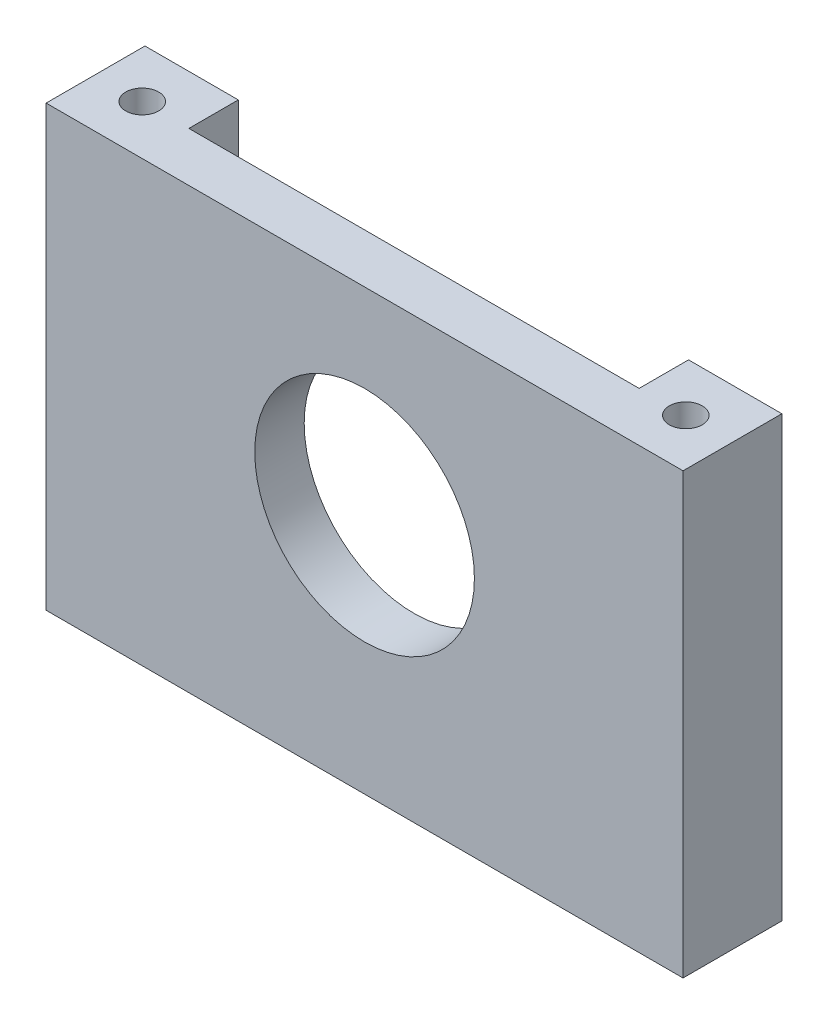
ISO-10303-21;
HEADER;
FILE_DESCRIPTION(('STEP AP214'),'2;1');
FILE_NAME('part.step','',(''),(''),'','','');
FILE_SCHEMA(('AUTOMOTIVE_DESIGN { 1 0 10303 214 1 1 1 1 }'));
ENDSEC;
DATA;
#1=APPLICATION_CONTEXT('core data for automotive mechanical design processes');
#2=APPLICATION_PROTOCOL_DEFINITION('international standard','automotive_design',2000,#1);
#3=PRODUCT_CONTEXT('',#1,'mechanical');
#4=PRODUCT('Part','Part','',(#3));
#5=PRODUCT_RELATED_PRODUCT_CATEGORY('part','',(#4));
#6=PRODUCT_DEFINITION_FORMATION('','',#4);
#7=PRODUCT_DEFINITION_CONTEXT('part definition',#1,'design');
#8=PRODUCT_DEFINITION('design','',#6,#7);
#9=PRODUCT_DEFINITION_SHAPE('','',#8);
#10=(LENGTH_UNIT() NAMED_UNIT(*) SI_UNIT(.MILLI.,.METRE.));
#11=(NAMED_UNIT(*) PLANE_ANGLE_UNIT() SI_UNIT($,.RADIAN.));
#12=(NAMED_UNIT(*) SI_UNIT($,.STERADIAN.) SOLID_ANGLE_UNIT());
#13=UNCERTAINTY_MEASURE_WITH_UNIT(LENGTH_MEASURE(1.E-05),#10,'distance_accuracy_value','');
#14=(GEOMETRIC_REPRESENTATION_CONTEXT(3) GLOBAL_UNCERTAINTY_ASSIGNED_CONTEXT((#13)) GLOBAL_UNIT_ASSIGNED_CONTEXT((#10,
#11,#12)) REPRESENTATION_CONTEXT('',''));
#15=CARTESIAN_POINT('',(0.,0.,0.));
#16=DIRECTION('',(0.,0.,1.));
#17=DIRECTION('',(1.,0.,0.));
#18=AXIS2_PLACEMENT_3D('',#15,#16,#17);
#19=CARTESIAN_POINT('',(0.,0.,0.));
#20=DIRECTION('',(0.,0.,1.));
#21=DIRECTION('',(1.,0.,0.));
#22=AXIS2_PLACEMENT_3D('',#19,#20,#21);
#23=PLANE('',#22);
#24=DIRECTION('',(-1.,0.,0.));
#25=VECTOR('',#24,1.);
#26=CARTESIAN_POINT('',(-29.,20.,0.));
#27=LINE('',#26,#25);
#28=CARTESIAN_POINT('',(-20.5,20.,0.));
#29=VERTEX_POINT('',#28);
#30=CARTESIAN_POINT('',(-29.,20.,0.));
#31=VERTEX_POINT('',#30);
#32=EDGE_CURVE('E168',#29,#31,#27,.T.);
#33=ORIENTED_EDGE('',*,*,#32,.F.);
#34=DIRECTION('',(0.,1.,0.));
#35=VECTOR('',#34,1.);
#36=CARTESIAN_POINT('',(-20.5,20.,0.));
#37=LINE('',#36,#35);
#38=CARTESIAN_POINT('',(-20.5,-20.,0.));
#39=VERTEX_POINT('',#38);
#40=EDGE_CURVE('E126',#39,#29,#37,.T.);
#41=ORIENTED_EDGE('',*,*,#40,.F.);
#42=DIRECTION('',(1.,0.,0.));
#43=VECTOR('',#42,1.);
#44=CARTESIAN_POINT('',(-29.,-20.,0.));
#45=LINE('',#44,#43);
#46=CARTESIAN_POINT('',(-29.,-20.,0.));
#47=VERTEX_POINT('',#46);
#48=EDGE_CURVE('E160',#47,#39,#45,.T.);
#49=ORIENTED_EDGE('',*,*,#48,.F.);
#50=DIRECTION('',(0.,-1.,0.));
#51=VECTOR('',#50,1.);
#52=CARTESIAN_POINT('',(-29.,20.,0.));
#53=LINE('',#52,#51);
#54=EDGE_CURVE('E171',#31,#47,#53,.T.);
#55=ORIENTED_EDGE('',*,*,#54,.F.);
#56=EDGE_LOOP('',(#33,#41,#49,#55));
#57=FACE_BOUND('',#56,.T.);
#58=ADVANCED_FACE('F46',(#57),#23,.F.);
#59=CARTESIAN_POINT('',(0.,2.,9.));
#60=DIRECTION('',(0.,0.,-1.));
#61=DIRECTION('',(-1.,0.,0.));
#62=AXIS2_PLACEMENT_3D('',#59,#60,#61);
#63=CYLINDRICAL_SURFACE('',#62,10.);
#64=CARTESIAN_POINT('',(0.,2.,9.));
#65=DIRECTION('',(0.,0.,1.));
#66=DIRECTION('',(1.,0.,0.));
#67=AXIS2_PLACEMENT_3D('',#64,#65,#66);
#68=CIRCLE('',#67,10.);
#69=CARTESIAN_POINT('',(10.,2.,9.));
#70=VERTEX_POINT('',#69);
#71=EDGE_CURVE('E154',#70,#70,#68,.T.);
#72=ORIENTED_EDGE('',*,*,#71,.T.);
#73=EDGE_LOOP('',(#72));
#74=FACE_BOUND('',#73,.T.);
#75=CARTESIAN_POINT('',(0.,2.,4.5));
#76=DIRECTION('',(0.,0.,-1.));
#77=DIRECTION('',(-1.,0.,0.));
#78=AXIS2_PLACEMENT_3D('',#75,#76,#77);
#79=CIRCLE('',#78,10.);
#80=CARTESIAN_POINT('',(-10.,2.,4.5));
#81=VERTEX_POINT('',#80);
#82=EDGE_CURVE('E50',#81,#81,#79,.T.);
#83=ORIENTED_EDGE('',*,*,#82,.T.);
#84=EDGE_LOOP('',(#83));
#85=FACE_BOUND('',#84,.T.);
#86=ADVANCED_FACE('F196',(#74,#85),#63,.F.);
#87=CARTESIAN_POINT('',(0.,0.,9.));
#88=DIRECTION('',(0.,0.,1.));
#89=DIRECTION('',(1.,0.,0.));
#90=AXIS2_PLACEMENT_3D('',#87,#88,#89);
#91=PLANE('',#90);
#92=DIRECTION('',(0.,1.,0.));
#93=VECTOR('',#92,1.);
#94=CARTESIAN_POINT('',(29.,20.,9.));
#95=LINE('',#94,#93);
#96=CARTESIAN_POINT('',(29.,-20.,9.));
#97=VERTEX_POINT('',#96);
#98=CARTESIAN_POINT('',(29.,20.,9.));
#99=VERTEX_POINT('',#98);
#100=EDGE_CURVE('E158',#97,#99,#95,.T.);
#101=ORIENTED_EDGE('',*,*,#100,.T.);
#102=DIRECTION('',(-1.,0.,0.));
#103=VECTOR('',#102,1.);
#104=CARTESIAN_POINT('',(-29.,20.,9.));
#105=LINE('',#104,#103);
#106=CARTESIAN_POINT('',(-29.,20.,9.));
#107=VERTEX_POINT('',#106);
#108=EDGE_CURVE('E99',#99,#107,#105,.T.);
#109=ORIENTED_EDGE('',*,*,#108,.T.);
#110=DIRECTION('',(0.,-1.,0.));
#111=VECTOR('',#110,1.);
#112=CARTESIAN_POINT('',(-29.,20.,9.));
#113=LINE('',#112,#111);
#114=CARTESIAN_POINT('',(-29.,-20.,9.));
#115=VERTEX_POINT('',#114);
#116=EDGE_CURVE('E162',#107,#115,#113,.T.);
#117=ORIENTED_EDGE('',*,*,#116,.T.);
#118=DIRECTION('',(1.,0.,0.));
#119=VECTOR('',#118,1.);
#120=CARTESIAN_POINT('',(-29.,-20.,9.));
#121=LINE('',#120,#119);
#122=EDGE_CURVE('E71',#115,#97,#121,.T.);
#123=ORIENTED_EDGE('',*,*,#122,.T.);
#124=EDGE_LOOP('',(#101,#109,#117,#123));
#125=FACE_BOUND('',#124,.T.);
#126=ORIENTED_EDGE('',*,*,#71,.F.);
#127=EDGE_LOOP('',(#126));
#128=FACE_BOUND('',#127,.T.);
#129=ADVANCED_FACE('F192',(#125,#128),#91,.T.);
#130=CARTESIAN_POINT('',(20.5,-20.,0.));
#131=VERTEX_POINT('',#130);
#132=CARTESIAN_POINT('',(29.,-20.,0.));
#133=VERTEX_POINT('',#132);
#134=EDGE_CURVE('E92',#131,#133,#45,.T.);
#135=ORIENTED_EDGE('',*,*,#134,.F.);
#136=DIRECTION('',(0.,-1.,0.));
#137=VECTOR('',#136,1.);
#138=CARTESIAN_POINT('',(20.5,20.,0.));
#139=LINE('',#138,#137);
#140=CARTESIAN_POINT('',(20.5,20.,0.));
#141=VERTEX_POINT('',#140);
#142=EDGE_CURVE('E137',#141,#131,#139,.T.);
#143=ORIENTED_EDGE('',*,*,#142,.F.);
#144=CARTESIAN_POINT('',(29.,20.,0.));
#145=VERTEX_POINT('',#144);
#146=EDGE_CURVE('E169',#145,#141,#27,.T.);
#147=ORIENTED_EDGE('',*,*,#146,.F.);
#148=DIRECTION('',(0.,1.,0.));
#149=VECTOR('',#148,1.);
#150=CARTESIAN_POINT('',(29.,20.,0.));
#151=LINE('',#150,#149);
#152=EDGE_CURVE('E157',#133,#145,#151,.T.);
#153=ORIENTED_EDGE('',*,*,#152,.F.);
#154=EDGE_LOOP('',(#135,#143,#147,#153));
#155=FACE_BOUND('',#154,.T.);
#156=ADVANCED_FACE('F195',(#155),#23,.F.);
#157=CARTESIAN_POINT('',(29.,20.,9.));
#158=DIRECTION('',(-1.,0.,0.));
#159=DIRECTION('',(0.,-1.,0.));
#160=AXIS2_PLACEMENT_3D('',#157,#158,#159);
#161=PLANE('',#160);
#162=ORIENTED_EDGE('',*,*,#152,.T.);
#163=DIRECTION('',(0.,0.,-1.));
#164=VECTOR('',#163,1.);
#165=CARTESIAN_POINT('',(29.,20.,9.));
#166=LINE('',#165,#164);
#167=EDGE_CURVE('E13',#99,#145,#166,.T.);
#168=ORIENTED_EDGE('',*,*,#167,.F.);
#169=ORIENTED_EDGE('',*,*,#100,.F.);
#170=DIRECTION('',(0.,0.,-1.));
#171=VECTOR('',#170,1.);
#172=CARTESIAN_POINT('',(29.,-20.,9.));
#173=LINE('',#172,#171);
#174=EDGE_CURVE('E165',#97,#133,#173,.T.);
#175=ORIENTED_EDGE('',*,*,#174,.T.);
#176=EDGE_LOOP('',(#162,#168,#169,#175));
#177=FACE_BOUND('',#176,.T.);
#178=ADVANCED_FACE('F48',(#177),#161,.F.);
#179=CARTESIAN_POINT('',(-29.,20.,9.));
#180=DIRECTION('',(0.,-1.,0.));
#181=DIRECTION('',(0.,0.,-1.));
#182=AXIS2_PLACEMENT_3D('',#179,#180,#181);
#183=PLANE('',#182);
#184=CARTESIAN_POINT('',(-24.75,20.,4.5));
#185=DIRECTION('',(0.,1.,0.));
#186=DIRECTION('',(0.,0.,1.));
#187=AXIS2_PLACEMENT_3D('',#184,#185,#186);
#188=CIRCLE('',#187,1.5);
#189=CARTESIAN_POINT('',(-24.75,20.,6.));
#190=VERTEX_POINT('',#189);
#191=EDGE_CURVE('E256',#190,#190,#188,.T.);
#192=ORIENTED_EDGE('',*,*,#191,.F.);
#193=EDGE_LOOP('',(#192));
#194=FACE_BOUND('',#193,.T.);
#195=CARTESIAN_POINT('',(24.75,20.,4.5));
#196=DIRECTION('',(0.,1.,0.));
#197=DIRECTION('',(0.,0.,1.));
#198=AXIS2_PLACEMENT_3D('',#195,#196,#197);
#199=CIRCLE('',#198,1.5);
#200=CARTESIAN_POINT('',(24.75,20.,6.));
#201=VERTEX_POINT('',#200);
#202=EDGE_CURVE('E252',#201,#201,#199,.T.);
#203=ORIENTED_EDGE('',*,*,#202,.F.);
#204=EDGE_LOOP('',(#203));
#205=FACE_BOUND('',#204,.T.);
#206=DIRECTION('',(1.,0.,0.));
#207=VECTOR('',#206,1.);
#208=CARTESIAN_POINT('',(20.5,20.,4.5));
#209=LINE('',#208,#207);
#210=CARTESIAN_POINT('',(-20.5,20.,4.5));
#211=VERTEX_POINT('',#210);
#212=CARTESIAN_POINT('',(20.5,20.,4.5));
#213=VERTEX_POINT('',#212);
#214=EDGE_CURVE('E133',#211,#213,#209,.T.);
#215=ORIENTED_EDGE('',*,*,#214,.F.);
#216=DIRECTION('',(0.,0.,-1.));
#217=VECTOR('',#216,1.);
#218=CARTESIAN_POINT('',(-20.5,20.,4.5));
#219=LINE('',#218,#217);
#220=EDGE_CURVE('E121',#211,#29,#219,.T.);
#221=ORIENTED_EDGE('',*,*,#220,.T.);
#222=ORIENTED_EDGE('',*,*,#32,.T.);
#223=DIRECTION('',(0.,0.,-1.));
#224=VECTOR('',#223,1.);
#225=CARTESIAN_POINT('',(-29.,20.,9.));
#226=LINE('',#225,#224);
#227=EDGE_CURVE('E55',#107,#31,#226,.T.);
#228=ORIENTED_EDGE('',*,*,#227,.F.);
#229=ORIENTED_EDGE('',*,*,#108,.F.);
#230=ORIENTED_EDGE('',*,*,#167,.T.);
#231=ORIENTED_EDGE('',*,*,#146,.T.);
#232=DIRECTION('',(0.,0.,-1.));
#233=VECTOR('',#232,1.);
#234=CARTESIAN_POINT('',(20.5,20.,4.5));
#235=LINE('',#234,#233);
#236=EDGE_CURVE('E129',#213,#141,#235,.T.);
#237=ORIENTED_EDGE('',*,*,#236,.F.);
#238=EDGE_LOOP('',(#215,#221,#222,#228,#229,#230,#231,#237));
#239=FACE_BOUND('',#238,.T.);
#240=ADVANCED_FACE('F139',(#194,#205,#239),#183,.F.);
#241=CARTESIAN_POINT('',(-29.,20.,9.));
#242=DIRECTION('',(1.,0.,0.));
#243=DIRECTION('',(0.,1.,0.));
#244=AXIS2_PLACEMENT_3D('',#241,#242,#243);
#245=PLANE('',#244);
#246=ORIENTED_EDGE('',*,*,#54,.T.);
#247=DIRECTION('',(0.,0.,-1.));
#248=VECTOR('',#247,1.);
#249=CARTESIAN_POINT('',(-29.,-20.,9.));
#250=LINE('',#249,#248);
#251=EDGE_CURVE('E176',#115,#47,#250,.T.);
#252=ORIENTED_EDGE('',*,*,#251,.F.);
#253=ORIENTED_EDGE('',*,*,#116,.F.);
#254=ORIENTED_EDGE('',*,*,#227,.T.);
#255=EDGE_LOOP('',(#246,#252,#253,#254));
#256=FACE_BOUND('',#255,.T.);
#257=ADVANCED_FACE('F183',(#256),#245,.F.);
#258=CARTESIAN_POINT('',(-29.,-20.,9.));
#259=DIRECTION('',(0.,1.,0.));
#260=DIRECTION('',(0.,0.,1.));
#261=AXIS2_PLACEMENT_3D('',#258,#259,#260);
#262=PLANE('',#261);
#263=CARTESIAN_POINT('',(-24.75,-20.,4.5));
#264=DIRECTION('',(0.,1.,0.));
#265=DIRECTION('',(0.,0.,1.));
#266=AXIS2_PLACEMENT_3D('',#263,#264,#265);
#267=CIRCLE('',#266,1.5);
#268=CARTESIAN_POINT('',(-24.75,-20.,6.));
#269=VERTEX_POINT('',#268);
#270=EDGE_CURVE('E249',#269,#269,#267,.T.);
#271=ORIENTED_EDGE('',*,*,#270,.T.);
#272=EDGE_LOOP('',(#271));
#273=FACE_BOUND('',#272,.T.);
#274=CARTESIAN_POINT('',(24.75,-20.,4.5));
#275=DIRECTION('',(0.,1.,0.));
#276=DIRECTION('',(0.,0.,1.));
#277=AXIS2_PLACEMENT_3D('',#274,#275,#276);
#278=CIRCLE('',#277,1.5);
#279=CARTESIAN_POINT('',(24.75,-20.,6.));
#280=VERTEX_POINT('',#279);
#281=EDGE_CURVE('E147',#280,#280,#278,.T.);
#282=ORIENTED_EDGE('',*,*,#281,.T.);
#283=EDGE_LOOP('',(#282));
#284=FACE_BOUND('',#283,.T.);
#285=ORIENTED_EDGE('',*,*,#48,.T.);
#286=DIRECTION('',(0.,0.,-1.));
#287=VECTOR('',#286,1.);
#288=CARTESIAN_POINT('',(-20.5,-20.,4.5));
#289=LINE('',#288,#287);
#290=CARTESIAN_POINT('',(-20.5,-20.,4.5));
#291=VERTEX_POINT('',#290);
#292=EDGE_CURVE('E149',#291,#39,#289,.T.);
#293=ORIENTED_EDGE('',*,*,#292,.F.);
#294=DIRECTION('',(-1.,0.,0.));
#295=VECTOR('',#294,1.);
#296=CARTESIAN_POINT('',(20.5,-20.,4.5));
#297=LINE('',#296,#295);
#298=CARTESIAN_POINT('',(20.5,-20.,4.5));
#299=VERTEX_POINT('',#298);
#300=EDGE_CURVE('E130',#299,#291,#297,.T.);
#301=ORIENTED_EDGE('',*,*,#300,.F.);
#302=DIRECTION('',(0.,0.,-1.));
#303=VECTOR('',#302,1.);
#304=CARTESIAN_POINT('',(20.5,-20.,4.5));
#305=LINE('',#304,#303);
#306=EDGE_CURVE('E151',#299,#131,#305,.T.);
#307=ORIENTED_EDGE('',*,*,#306,.T.);
#308=ORIENTED_EDGE('',*,*,#134,.T.);
#309=ORIENTED_EDGE('',*,*,#174,.F.);
#310=ORIENTED_EDGE('',*,*,#122,.F.);
#311=ORIENTED_EDGE('',*,*,#251,.T.);
#312=EDGE_LOOP('',(#285,#293,#301,#307,#308,#309,#310,#311));
#313=FACE_BOUND('',#312,.T.);
#314=ADVANCED_FACE('F187',(#273,#284,#313),#262,.F.);
#315=CARTESIAN_POINT('',(-20.5,20.,4.5));
#316=DIRECTION('',(-1.,0.,0.));
#317=DIRECTION('',(0.,0.,1.));
#318=AXIS2_PLACEMENT_3D('',#315,#316,#317);
#319=PLANE('',#318);
#320=ORIENTED_EDGE('',*,*,#40,.T.);
#321=ORIENTED_EDGE('',*,*,#220,.F.);
#322=DIRECTION('',(0.,1.,0.));
#323=VECTOR('',#322,1.);
#324=CARTESIAN_POINT('',(-20.5,20.,4.5));
#325=LINE('',#324,#323);
#326=EDGE_CURVE('E124',#291,#211,#325,.T.);
#327=ORIENTED_EDGE('',*,*,#326,.F.);
#328=ORIENTED_EDGE('',*,*,#292,.T.);
#329=EDGE_LOOP('',(#320,#321,#327,#328));
#330=FACE_BOUND('',#329,.T.);
#331=ADVANCED_FACE('F123',(#330),#319,.F.);
#332=CARTESIAN_POINT('',(20.5,20.,4.5));
#333=DIRECTION('',(1.,0.,0.));
#334=DIRECTION('',(0.,0.,-1.));
#335=AXIS2_PLACEMENT_3D('',#332,#333,#334);
#336=PLANE('',#335);
#337=ORIENTED_EDGE('',*,*,#142,.T.);
#338=ORIENTED_EDGE('',*,*,#306,.F.);
#339=DIRECTION('',(0.,-1.,0.));
#340=VECTOR('',#339,1.);
#341=CARTESIAN_POINT('',(20.5,20.,4.5));
#342=LINE('',#341,#340);
#343=EDGE_CURVE('E62',#213,#299,#342,.T.);
#344=ORIENTED_EDGE('',*,*,#343,.F.);
#345=ORIENTED_EDGE('',*,*,#236,.T.);
#346=EDGE_LOOP('',(#337,#338,#344,#345));
#347=FACE_BOUND('',#346,.T.);
#348=ADVANCED_FACE('F208',(#347),#336,.F.);
#349=CARTESIAN_POINT('',(0.,0.,4.5));
#350=DIRECTION('',(0.,0.,-1.));
#351=DIRECTION('',(-1.,0.,0.));
#352=AXIS2_PLACEMENT_3D('',#349,#350,#351);
#353=PLANE('',#352);
#354=ORIENTED_EDGE('',*,*,#82,.F.);
#355=EDGE_LOOP('',(#354));
#356=FACE_BOUND('',#355,.T.);
#357=ORIENTED_EDGE('',*,*,#326,.T.);
#358=ORIENTED_EDGE('',*,*,#214,.T.);
#359=ORIENTED_EDGE('',*,*,#343,.T.);
#360=ORIENTED_EDGE('',*,*,#300,.T.);
#361=EDGE_LOOP('',(#357,#358,#359,#360));
#362=FACE_BOUND('',#361,.T.);
#363=ADVANCED_FACE('F132',(#356,#362),#353,.T.);
#364=CARTESIAN_POINT('',(24.75,-20.,4.5));
#365=DIRECTION('',(0.,1.,0.));
#366=DIRECTION('',(0.,0.,1.));
#367=AXIS2_PLACEMENT_3D('',#364,#365,#366);
#368=CYLINDRICAL_SURFACE('',#367,1.5);
#369=ORIENTED_EDGE('',*,*,#281,.F.);
#370=EDGE_LOOP('',(#369));
#371=FACE_BOUND('',#370,.T.);
#372=ORIENTED_EDGE('',*,*,#202,.T.);
#373=EDGE_LOOP('',(#372));
#374=FACE_BOUND('',#373,.T.);
#375=ADVANCED_FACE('F207',(#371,#374),#368,.F.);
#376=CARTESIAN_POINT('',(-24.75,-20.,4.5));
#377=DIRECTION('',(0.,1.,0.));
#378=DIRECTION('',(0.,0.,1.));
#379=AXIS2_PLACEMENT_3D('',#376,#377,#378);
#380=CYLINDRICAL_SURFACE('',#379,1.5);
#381=ORIENTED_EDGE('',*,*,#270,.F.);
#382=EDGE_LOOP('',(#381));
#383=FACE_BOUND('',#382,.T.);
#384=ORIENTED_EDGE('',*,*,#191,.T.);
#385=EDGE_LOOP('',(#384));
#386=FACE_BOUND('',#385,.T.);
#387=ADVANCED_FACE('F214',(#383,#386),#380,.F.);
#388=CLOSED_SHELL('',(#58,#86,#129,#156,#178,#240,#257,#314,#331,#348,#363,#375,#387));
#389=MANIFOLD_SOLID_BREP('B2',#388);
#390=ADVANCED_BREP_SHAPE_REPRESENTATION('',(#18,#389),#14);
#391=SHAPE_DEFINITION_REPRESENTATION(#9,#390);
ENDSEC;
END-ISO-10303-21;
